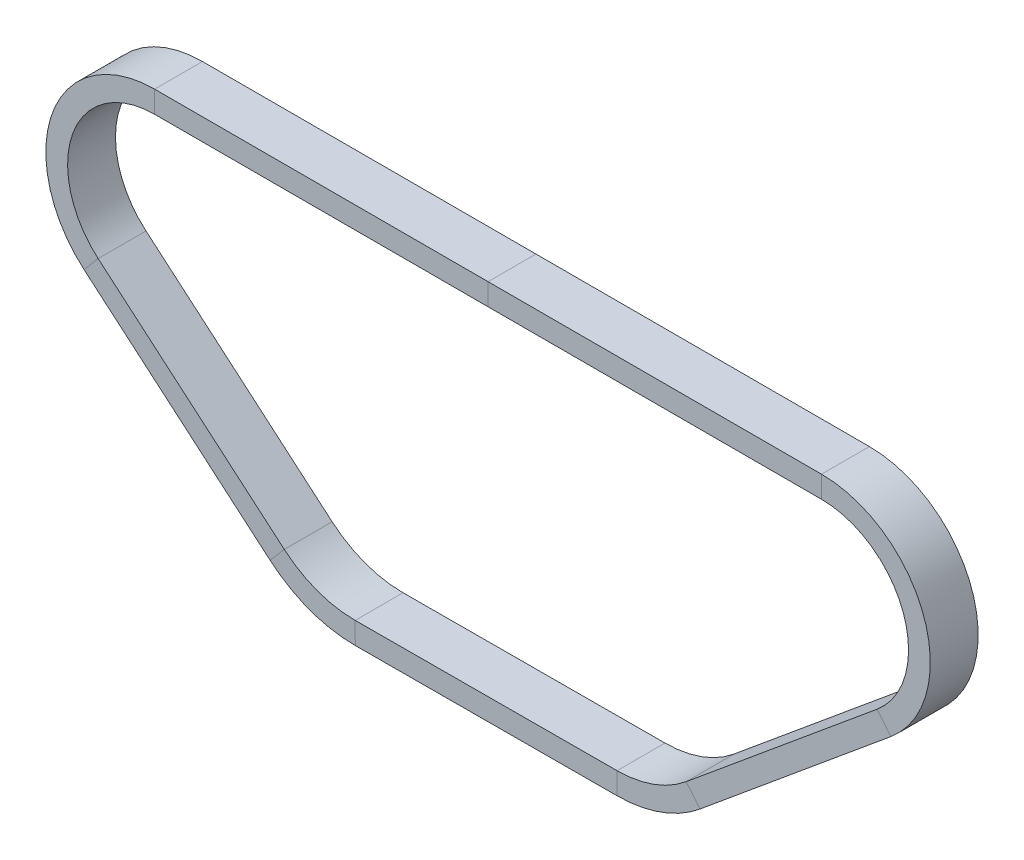
ISO-10303-21;
HEADER;
FILE_DESCRIPTION(('STEP AP214'),'2;1');
FILE_NAME('part.step','',(''),(''),'','','');
FILE_SCHEMA(('AUTOMOTIVE_DESIGN { 1 0 10303 214 1 1 1 1 }'));
ENDSEC;
DATA;
#1=APPLICATION_CONTEXT('core data for automotive mechanical design processes');
#2=APPLICATION_PROTOCOL_DEFINITION('international standard','automotive_design',2000,#1);
#3=PRODUCT_CONTEXT('',#1,'mechanical');
#4=PRODUCT('Part','Part','',(#3));
#5=PRODUCT_RELATED_PRODUCT_CATEGORY('part','',(#4));
#6=PRODUCT_DEFINITION_FORMATION('','',#4);
#7=PRODUCT_DEFINITION_CONTEXT('part definition',#1,'design');
#8=PRODUCT_DEFINITION('design','',#6,#7);
#9=PRODUCT_DEFINITION_SHAPE('','',#8);
#10=(LENGTH_UNIT() NAMED_UNIT(*) SI_UNIT(.MILLI.,.METRE.));
#11=(NAMED_UNIT(*) PLANE_ANGLE_UNIT() SI_UNIT($,.RADIAN.));
#12=(NAMED_UNIT(*) SI_UNIT($,.STERADIAN.) SOLID_ANGLE_UNIT());
#13=UNCERTAINTY_MEASURE_WITH_UNIT(LENGTH_MEASURE(1.E-05),#10,'distance_accuracy_value','');
#14=(GEOMETRIC_REPRESENTATION_CONTEXT(3) GLOBAL_UNCERTAINTY_ASSIGNED_CONTEXT((#13)) GLOBAL_UNIT_ASSIGNED_CONTEXT((#10,
#11,#12)) REPRESENTATION_CONTEXT('',''));
#15=CARTESIAN_POINT('',(0.,0.,0.));
#16=DIRECTION('',(0.,0.,1.));
#17=DIRECTION('',(1.,0.,0.));
#18=AXIS2_PLACEMENT_3D('',#15,#16,#17);
#19=CARTESIAN_POINT('',(766.320606961868,438.425171825375,55.));
#20=DIRECTION('',(0.,0.,-1.));
#21=DIRECTION('',(0.,1.,0.));
#22=AXIS2_PLACEMENT_3D('',#19,#20,#21);
#23=PLANE('',#22);
#24=DIRECTION('',(0.,-1.,0.));
#25=VECTOR('',#24,1.);
#26=CARTESIAN_POINT('',(766.320606961868,438.425171825375,55.));
#27=LINE('',#26,#25);
#28=CARTESIAN_POINT('',(766.320606961868,438.425171825375,55.));
#29=VERTEX_POINT('',#28);
#30=CARTESIAN_POINT('',(766.320606961868,388.425171825375,55.));
#31=VERTEX_POINT('',#30);
#32=EDGE_CURVE('E214',#29,#31,#27,.T.);
#33=ORIENTED_EDGE('',*,*,#32,.F.);
#34=DIRECTION('',(-1.,0.,0.));
#35=VECTOR('',#34,1.);
#36=CARTESIAN_POINT('',(766.320606961868,438.425171825375,55.));
#37=LINE('',#36,#35);
#38=CARTESIAN_POINT('',(0.,438.425171825375,55.));
#39=VERTEX_POINT('',#38);
#40=EDGE_CURVE('E213',#29,#39,#37,.T.);
#41=ORIENTED_EDGE('',*,*,#40,.T.);
#42=DIRECTION('',(0.,-1.,0.));
#43=VECTOR('',#42,1.);
#44=CARTESIAN_POINT('',(0.,438.425171825375,55.));
#45=LINE('',#44,#43);
#46=CARTESIAN_POINT('',(0.,388.425171825375,55.));
#47=VERTEX_POINT('',#46);
#48=EDGE_CURVE('E188',#39,#47,#45,.T.);
#49=ORIENTED_EDGE('',*,*,#48,.T.);
#50=DIRECTION('',(-1.,0.,0.));
#51=VECTOR('',#50,1.);
#52=CARTESIAN_POINT('',(766.320606961868,388.425171825375,55.));
#53=LINE('',#52,#51);
#54=EDGE_CURVE('E218',#31,#47,#53,.T.);
#55=ORIENTED_EDGE('',*,*,#54,.F.);
#56=EDGE_LOOP('',(#33,#41,#49,#55));
#57=FACE_BOUND('',#56,.T.);
#58=ADVANCED_FACE('F32',(#57),#23,.F.);
#59=CARTESIAN_POINT('',(0.,438.425171825375,55.));
#60=DIRECTION('',(0.,0.,-1.));
#61=DIRECTION('',(0.,1.,0.));
#62=AXIS2_PLACEMENT_3D('',#59,#60,#61);
#63=PLANE('',#62);
#64=DIRECTION('',(-1.,0.,0.));
#65=VECTOR('',#64,1.);
#66=CARTESIAN_POINT('',(0.,388.425171825375,55.));
#67=LINE('',#66,#65);
#68=CARTESIAN_POINT('',(-766.320606961868,388.425171825375,55.));
#69=VERTEX_POINT('',#68);
#70=EDGE_CURVE('E194',#47,#69,#67,.T.);
#71=ORIENTED_EDGE('',*,*,#70,.F.);
#72=ORIENTED_EDGE('',*,*,#48,.F.);
#73=DIRECTION('',(-1.,0.,0.));
#74=VECTOR('',#73,1.);
#75=CARTESIAN_POINT('',(0.,438.425171825375,55.));
#76=LINE('',#75,#74);
#77=CARTESIAN_POINT('',(-766.320606961868,438.425171825375,55.));
#78=VERTEX_POINT('',#77);
#79=EDGE_CURVE('E192',#39,#78,#76,.T.);
#80=ORIENTED_EDGE('',*,*,#79,.T.);
#81=DIRECTION('',(0.,-1.,0.));
#82=VECTOR('',#81,1.);
#83=CARTESIAN_POINT('',(-766.320606961868,438.425171825375,55.));
#84=LINE('',#83,#82);
#85=EDGE_CURVE('E210',#78,#69,#84,.T.);
#86=ORIENTED_EDGE('',*,*,#85,.T.);
#87=EDGE_LOOP('',(#71,#72,#80,#86));
#88=FACE_BOUND('',#87,.T.);
#89=ADVANCED_FACE('F190',(#88),#63,.F.);
#90=CARTESIAN_POINT('',(0.,388.425171825375,55.));
#91=DIRECTION('',(0.,1.,0.));
#92=DIRECTION('',(-1.,0.,0.));
#93=AXIS2_PLACEMENT_3D('',#90,#91,#92);
#94=PLANE('',#93);
#95=DIRECTION('',(-1.,0.,0.));
#96=VECTOR('',#95,1.);
#97=CARTESIAN_POINT('',(0.,388.425171825375,-55.));
#98=LINE('',#97,#96);
#99=CARTESIAN_POINT('',(0.,388.425171825375,-55.));
#100=VERTEX_POINT('',#99);
#101=CARTESIAN_POINT('',(-766.320606961868,388.425171825375,-55.));
#102=VERTEX_POINT('',#101);
#103=EDGE_CURVE('E275',#100,#102,#98,.T.);
#104=ORIENTED_EDGE('',*,*,#103,.F.);
#105=DIRECTION('',(0.,0.,-1.));
#106=VECTOR('',#105,1.);
#107=CARTESIAN_POINT('',(0.,388.425171825375,55.));
#108=LINE('',#107,#106);
#109=EDGE_CURVE('E199',#47,#100,#108,.T.);
#110=ORIENTED_EDGE('',*,*,#109,.F.);
#111=ORIENTED_EDGE('',*,*,#70,.T.);
#112=DIRECTION('',(0.,0.,-1.));
#113=VECTOR('',#112,1.);
#114=CARTESIAN_POINT('',(-766.320606961868,388.425171825375,55.));
#115=LINE('',#114,#113);
#116=EDGE_CURVE('E331',#69,#102,#115,.T.);
#117=ORIENTED_EDGE('',*,*,#116,.T.);
#118=EDGE_LOOP('',(#104,#110,#111,#117));
#119=FACE_BOUND('',#118,.T.);
#120=ADVANCED_FACE('F369',(#119),#94,.F.);
#121=CARTESIAN_POINT('',(0.,438.425171825375,-55.));
#122=DIRECTION('',(0.,0.,1.));
#123=DIRECTION('',(0.,-1.,0.));
#124=AXIS2_PLACEMENT_3D('',#121,#122,#123);
#125=PLANE('',#124);
#126=DIRECTION('',(-1.,0.,0.));
#127=VECTOR('',#126,1.);
#128=CARTESIAN_POINT('',(0.,438.425171825375,-55.));
#129=LINE('',#128,#127);
#130=CARTESIAN_POINT('',(0.,438.425171825375,-55.));
#131=VERTEX_POINT('',#130);
#132=CARTESIAN_POINT('',(-766.320606961868,438.425171825375,-55.));
#133=VERTEX_POINT('',#132);
#134=EDGE_CURVE('E229',#131,#133,#129,.T.);
#135=ORIENTED_EDGE('',*,*,#134,.F.);
#136=DIRECTION('',(0.,1.,0.));
#137=VECTOR('',#136,1.);
#138=CARTESIAN_POINT('',(0.,438.425171825375,-55.));
#139=LINE('',#138,#137);
#140=EDGE_CURVE('E221',#100,#131,#139,.T.);
#141=ORIENTED_EDGE('',*,*,#140,.F.);
#142=ORIENTED_EDGE('',*,*,#103,.T.);
#143=DIRECTION('',(0.,1.,0.));
#144=VECTOR('',#143,1.);
#145=CARTESIAN_POINT('',(-766.320606961868,438.425171825375,-55.));
#146=LINE('',#145,#144);
#147=EDGE_CURVE('E278',#102,#133,#146,.T.);
#148=ORIENTED_EDGE('',*,*,#147,.T.);
#149=EDGE_LOOP('',(#135,#141,#142,#148));
#150=FACE_BOUND('',#149,.T.);
#151=ADVANCED_FACE('F273',(#150),#125,.F.);
#152=CARTESIAN_POINT('',(0.,438.425171825375,55.));
#153=DIRECTION('',(0.,-1.,0.));
#154=DIRECTION('',(1.,0.,0.));
#155=AXIS2_PLACEMENT_3D('',#152,#153,#154);
#156=PLANE('',#155);
#157=DIRECTION('',(0.,0.,1.));
#158=VECTOR('',#157,1.);
#159=CARTESIAN_POINT('',(-766.320606961868,438.425171825375,55.));
#160=LINE('',#159,#158);
#161=EDGE_CURVE('E208',#133,#78,#160,.T.);
#162=ORIENTED_EDGE('',*,*,#161,.T.);
#163=ORIENTED_EDGE('',*,*,#79,.F.);
#164=DIRECTION('',(0.,0.,1.));
#165=VECTOR('',#164,1.);
#166=CARTESIAN_POINT('',(0.,438.425171825375,55.));
#167=LINE('',#166,#165);
#168=EDGE_CURVE('E206',#131,#39,#167,.T.);
#169=ORIENTED_EDGE('',*,*,#168,.F.);
#170=ORIENTED_EDGE('',*,*,#134,.T.);
#171=EDGE_LOOP('',(#162,#163,#169,#170));
#172=FACE_BOUND('',#171,.T.);
#173=ADVANCED_FACE('F204',(#172),#156,.F.);
#174=CARTESIAN_POINT('',(-766.320606961868,438.425171825375,55.));
#175=DIRECTION('',(0.,0.,-1.));
#176=DIRECTION('',(-1.,0.,0.));
#177=AXIS2_PLACEMENT_3D('',#174,#175,#176);
#178=PLANE('',#177);
#179=CARTESIAN_POINT('',(-766.320606961868,188.425171825375,55.));
#180=DIRECTION('',(0.,0.,1.));
#181=DIRECTION('',(0.,1.,0.));
#182=AXIS2_PLACEMENT_3D('',#179,#180,#181);
#183=CIRCLE('',#182,200.);
#184=CARTESIAN_POINT('',(-896.121286343144,36.2680700122841,55.));
#185=VERTEX_POINT('',#184);
#186=EDGE_CURVE('E337',#69,#185,#183,.T.);
#187=ORIENTED_EDGE('',*,*,#186,.F.);
#188=ORIENTED_EDGE('',*,*,#85,.F.);
#189=CARTESIAN_POINT('',(-766.320606961868,188.425171825375,55.));
#190=DIRECTION('',(0.,0.,1.));
#191=DIRECTION('',(0.,1.,0.));
#192=AXIS2_PLACEMENT_3D('',#189,#190,#191);
#193=CIRCLE('',#192,250.);
#194=CARTESIAN_POINT('',(-928.571456188463,-1.77120544098852,55.));
#195=VERTEX_POINT('',#194);
#196=EDGE_CURVE('E228',#78,#195,#193,.T.);
#197=ORIENTED_EDGE('',*,*,#196,.T.);
#198=DIRECTION('',(0.649003396906381,0.760785509065452,0.));
#199=VECTOR('',#198,1.);
#200=CARTESIAN_POINT('',(-928.571456188463,-1.77120544098858,55.));
#201=LINE('',#200,#199);
#202=EDGE_CURVE('E387',#195,#185,#201,.T.);
#203=ORIENTED_EDGE('',*,*,#202,.T.);
#204=EDGE_LOOP('',(#187,#188,#197,#203));
#205=FACE_BOUND('',#204,.T.);
#206=ADVANCED_FACE('F457',(#205),#178,.F.);
#207=CARTESIAN_POINT('',(-766.320606961868,188.425171825375,0.));
#208=DIRECTION('',(0.,0.,1.));
#209=DIRECTION('',(1.,0.,0.));
#210=AXIS2_PLACEMENT_3D('',#207,#208,#209);
#211=CYLINDRICAL_SURFACE('',#210,200.);
#212=CARTESIAN_POINT('',(-766.320606961868,188.425171825375,-55.));
#213=DIRECTION('',(0.,0.,1.));
#214=DIRECTION('',(0.,1.,0.));
#215=AXIS2_PLACEMENT_3D('',#212,#213,#214);
#216=CIRCLE('',#215,200.);
#217=CARTESIAN_POINT('',(-896.121286343144,36.2680700122841,-55.));
#218=VERTEX_POINT('',#217);
#219=EDGE_CURVE('E286',#102,#218,#216,.T.);
#220=ORIENTED_EDGE('',*,*,#219,.F.);
#221=ORIENTED_EDGE('',*,*,#116,.F.);
#222=ORIENTED_EDGE('',*,*,#186,.T.);
#223=DIRECTION('',(0.,0.,-1.));
#224=VECTOR('',#223,1.);
#225=CARTESIAN_POINT('',(-896.121286343144,36.268070012284,55.));
#226=LINE('',#225,#224);
#227=EDGE_CURVE('E334',#185,#218,#226,.T.);
#228=ORIENTED_EDGE('',*,*,#227,.T.);
#229=EDGE_LOOP('',(#220,#221,#222,#228));
#230=FACE_BOUND('',#229,.T.);
#231=ADVANCED_FACE('F373',(#230),#211,.F.);
#232=CARTESIAN_POINT('',(-766.320606961868,438.425171825375,-55.));
#233=DIRECTION('',(0.,0.,1.));
#234=DIRECTION('',(1.,0.,0.));
#235=AXIS2_PLACEMENT_3D('',#232,#233,#234);
#236=PLANE('',#235);
#237=CARTESIAN_POINT('',(-766.320606961868,188.425171825375,-55.));
#238=DIRECTION('',(0.,0.,1.));
#239=DIRECTION('',(0.,1.,0.));
#240=AXIS2_PLACEMENT_3D('',#237,#238,#239);
#241=CIRCLE('',#240,250.);
#242=CARTESIAN_POINT('',(-928.571456188463,-1.77120544098852,-55.));
#243=VERTEX_POINT('',#242);
#244=EDGE_CURVE('E234',#133,#243,#241,.T.);
#245=ORIENTED_EDGE('',*,*,#244,.F.);
#246=ORIENTED_EDGE('',*,*,#147,.F.);
#247=ORIENTED_EDGE('',*,*,#219,.T.);
#248=DIRECTION('',(-0.649003396906381,-0.760785509065452,0.));
#249=VECTOR('',#248,1.);
#250=CARTESIAN_POINT('',(-928.571456188463,-1.77120544098858,-55.));
#251=LINE('',#250,#249);
#252=EDGE_CURVE('E283',#218,#243,#251,.T.);
#253=ORIENTED_EDGE('',*,*,#252,.T.);
#254=EDGE_LOOP('',(#245,#246,#247,#253));
#255=FACE_BOUND('',#254,.T.);
#256=ADVANCED_FACE('F377',(#255),#236,.F.);
#257=CARTESIAN_POINT('',(-766.320606961868,188.425171825375,0.));
#258=DIRECTION('',(0.,0.,1.));
#259=DIRECTION('',(1.,0.,0.));
#260=AXIS2_PLACEMENT_3D('',#257,#258,#259);
#261=CYLINDRICAL_SURFACE('',#260,250.);
#262=DIRECTION('',(0.,0.,1.));
#263=VECTOR('',#262,1.);
#264=CARTESIAN_POINT('',(-928.571456188463,-1.77120544098858,55.));
#265=LINE('',#264,#263);
#266=EDGE_CURVE('E230',#243,#195,#265,.T.);
#267=ORIENTED_EDGE('',*,*,#266,.T.);
#268=ORIENTED_EDGE('',*,*,#196,.F.);
#269=ORIENTED_EDGE('',*,*,#161,.F.);
#270=ORIENTED_EDGE('',*,*,#244,.T.);
#271=EDGE_LOOP('',(#267,#268,#269,#270));
#272=FACE_BOUND('',#271,.T.);
#273=ADVANCED_FACE('F381',(#272),#261,.T.);
#274=CARTESIAN_POINT('',(-928.571456188463,-1.77120544098858,55.));
#275=DIRECTION('',(0.,0.,-1.));
#276=DIRECTION('',(0.,1.,0.));
#277=AXIS2_PLACEMENT_3D('',#274,#275,#276);
#278=PLANE('',#277);
#279=DIRECTION('',(0.760785509065453,-0.64900339690638,0.));
#280=VECTOR('',#279,1.);
#281=CARTESIAN_POINT('',(-896.121286343144,36.268070012284,55.));
#282=LINE('',#281,#280);
#283=CARTESIAN_POINT('',(-468.384334663063,-328.621549091738,55.));
#284=VERTEX_POINT('',#283);
#285=EDGE_CURVE('E342',#185,#284,#282,.T.);
#286=ORIENTED_EDGE('',*,*,#285,.F.);
#287=ORIENTED_EDGE('',*,*,#202,.F.);
#288=DIRECTION('',(0.760785509065453,-0.64900339690638,0.));
#289=VECTOR('',#288,1.);
#290=CARTESIAN_POINT('',(-928.571456188463,-1.77120544098858,55.));
#291=LINE('',#290,#289);
#292=CARTESIAN_POINT('',(-500.834504508382,-366.660824545011,55.));
#293=VERTEX_POINT('',#292);
#294=EDGE_CURVE('E233',#195,#293,#291,.T.);
#295=ORIENTED_EDGE('',*,*,#294,.T.);
#296=DIRECTION('',(0.64900339690638,0.760785509065453,0.));
#297=VECTOR('',#296,1.);
#298=CARTESIAN_POINT('',(-500.834504508382,-366.660824545011,55.));
#299=LINE('',#298,#297);
#300=EDGE_CURVE('E392',#293,#284,#299,.T.);
#301=ORIENTED_EDGE('',*,*,#300,.T.);
#302=EDGE_LOOP('',(#286,#287,#295,#301));
#303=FACE_BOUND('',#302,.T.);
#304=ADVANCED_FACE('F455',(#303),#278,.F.);
#305=CARTESIAN_POINT('',(-896.121286343144,36.268070012284,55.));
#306=DIRECTION('',(-0.64900339690638,-0.760785509065453,0.));
#307=DIRECTION('',(0.760785509065453,-0.64900339690638,0.));
#308=AXIS2_PLACEMENT_3D('',#305,#306,#307);
#309=PLANE('',#308);
#310=DIRECTION('',(0.760785509065453,-0.64900339690638,0.));
#311=VECTOR('',#310,1.);
#312=CARTESIAN_POINT('',(-896.121286343144,36.268070012284,-55.));
#313=LINE('',#312,#311);
#314=CARTESIAN_POINT('',(-468.384334663063,-328.621549091738,-55.));
#315=VERTEX_POINT('',#314);
#316=EDGE_CURVE('E291',#218,#315,#313,.T.);
#317=ORIENTED_EDGE('',*,*,#316,.F.);
#318=ORIENTED_EDGE('',*,*,#227,.F.);
#319=ORIENTED_EDGE('',*,*,#285,.T.);
#320=DIRECTION('',(0.,0.,-1.));
#321=VECTOR('',#320,1.);
#322=CARTESIAN_POINT('',(-468.384334663063,-328.621549091738,55.));
#323=LINE('',#322,#321);
#324=EDGE_CURVE('E339',#284,#315,#323,.T.);
#325=ORIENTED_EDGE('',*,*,#324,.T.);
#326=EDGE_LOOP('',(#317,#318,#319,#325));
#327=FACE_BOUND('',#326,.T.);
#328=ADVANCED_FACE('F454',(#327),#309,.F.);
#329=CARTESIAN_POINT('',(-928.571456188463,-1.77120544098858,-55.));
#330=DIRECTION('',(0.,0.,1.));
#331=DIRECTION('',(0.,-1.,0.));
#332=AXIS2_PLACEMENT_3D('',#329,#330,#331);
#333=PLANE('',#332);
#334=DIRECTION('',(0.760785509065453,-0.64900339690638,0.));
#335=VECTOR('',#334,1.);
#336=CARTESIAN_POINT('',(-928.571456188463,-1.77120544098858,-55.));
#337=LINE('',#336,#335);
#338=CARTESIAN_POINT('',(-500.834504508382,-366.660824545011,-55.));
#339=VERTEX_POINT('',#338);
#340=EDGE_CURVE('E239',#243,#339,#337,.T.);
#341=ORIENTED_EDGE('',*,*,#340,.F.);
#342=ORIENTED_EDGE('',*,*,#252,.F.);
#343=ORIENTED_EDGE('',*,*,#316,.T.);
#344=DIRECTION('',(-0.64900339690638,-0.760785509065453,0.));
#345=VECTOR('',#344,1.);
#346=CARTESIAN_POINT('',(-500.834504508382,-366.660824545011,-55.));
#347=LINE('',#346,#345);
#348=EDGE_CURVE('E288',#315,#339,#347,.T.);
#349=ORIENTED_EDGE('',*,*,#348,.T.);
#350=EDGE_LOOP('',(#341,#342,#343,#349));
#351=FACE_BOUND('',#350,.T.);
#352=ADVANCED_FACE('F452',(#351),#333,.F.);
#353=CARTESIAN_POINT('',(-928.571456188463,-1.77120544098858,55.));
#354=DIRECTION('',(0.64900339690638,0.760785509065453,0.));
#355=DIRECTION('',(-0.760785509065453,0.64900339690638,0.));
#356=AXIS2_PLACEMENT_3D('',#353,#354,#355);
#357=PLANE('',#356);
#358=DIRECTION('',(0.,0.,1.));
#359=VECTOR('',#358,1.);
#360=CARTESIAN_POINT('',(-500.834504508382,-366.660824545011,55.));
#361=LINE('',#360,#359);
#362=EDGE_CURVE('E235',#339,#293,#361,.T.);
#363=ORIENTED_EDGE('',*,*,#362,.T.);
#364=ORIENTED_EDGE('',*,*,#294,.F.);
#365=ORIENTED_EDGE('',*,*,#266,.F.);
#366=ORIENTED_EDGE('',*,*,#340,.T.);
#367=EDGE_LOOP('',(#363,#364,#365,#366));
#368=FACE_BOUND('',#367,.T.);
#369=ADVANCED_FACE('F450',(#368),#357,.F.);
#370=CARTESIAN_POINT('',(-500.834504508382,-366.660824545011,55.));
#371=DIRECTION('',(0.,0.,-1.));
#372=DIRECTION('',(-1.,0.,0.));
#373=AXIS2_PLACEMENT_3D('',#370,#371,#372);
#374=PLANE('',#373);
#375=CARTESIAN_POINT('',(-306.133485436468,-138.425171825375,55.));
#376=DIRECTION('',(0.,0.,1.));
#377=DIRECTION('',(-0.649003396906381,-0.760785509065452,0.));
#378=AXIS2_PLACEMENT_3D('',#375,#376,#377);
#379=CIRCLE('',#378,250.);
#380=CARTESIAN_POINT('',(-305.36994160237,-388.424005824283,55.));
#381=VERTEX_POINT('',#380);
#382=EDGE_CURVE('E347',#284,#381,#379,.T.);
#383=ORIENTED_EDGE('',*,*,#382,.F.);
#384=ORIENTED_EDGE('',*,*,#300,.F.);
#385=CARTESIAN_POINT('',(-306.133485436468,-138.425171825375,55.));
#386=DIRECTION('',(0.,0.,1.));
#387=DIRECTION('',(-0.649003396906381,-0.760785509065452,0.));
#388=AXIS2_PLACEMENT_3D('',#385,#386,#387);
#389=CIRCLE('',#388,300.);
#390=CARTESIAN_POINT('',(-305.217232835551,-438.423772624064,55.));
#391=VERTEX_POINT('',#390);
#392=EDGE_CURVE('E238',#293,#391,#389,.T.);
#393=ORIENTED_EDGE('',*,*,#392,.T.);
#394=DIRECTION('',(-0.00305417533639116,0.999995335995631,0.));
#395=VECTOR('',#394,1.);
#396=CARTESIAN_POINT('',(-305.217232835551,-438.423772624064,55.));
#397=LINE('',#396,#395);
#398=EDGE_CURVE('E397',#391,#381,#397,.T.);
#399=ORIENTED_EDGE('',*,*,#398,.T.);
#400=EDGE_LOOP('',(#383,#384,#393,#399));
#401=FACE_BOUND('',#400,.T.);
#402=ADVANCED_FACE('F446',(#401),#374,.F.);
#403=CARTESIAN_POINT('',(-306.133485436468,-138.425171825375,0.));
#404=DIRECTION('',(0.,0.,1.));
#405=DIRECTION('',(1.,0.,0.));
#406=AXIS2_PLACEMENT_3D('',#403,#404,#405);
#407=CYLINDRICAL_SURFACE('',#406,250.);
#408=CARTESIAN_POINT('',(-306.133485436468,-138.425171825375,-55.));
#409=DIRECTION('',(0.,0.,1.));
#410=DIRECTION('',(-0.649003396906381,-0.760785509065452,0.));
#411=AXIS2_PLACEMENT_3D('',#408,#409,#410);
#412=CIRCLE('',#411,250.);
#413=CARTESIAN_POINT('',(-305.36994160237,-388.424005824283,-55.));
#414=VERTEX_POINT('',#413);
#415=EDGE_CURVE('E296',#315,#414,#412,.T.);
#416=ORIENTED_EDGE('',*,*,#415,.F.);
#417=ORIENTED_EDGE('',*,*,#324,.F.);
#418=ORIENTED_EDGE('',*,*,#382,.T.);
#419=DIRECTION('',(0.,0.,-1.));
#420=VECTOR('',#419,1.);
#421=CARTESIAN_POINT('',(-305.36994160237,-388.424005824283,55.));
#422=LINE('',#421,#420);
#423=EDGE_CURVE('E344',#381,#414,#422,.T.);
#424=ORIENTED_EDGE('',*,*,#423,.T.);
#425=EDGE_LOOP('',(#416,#417,#418,#424));
#426=FACE_BOUND('',#425,.T.);
#427=ADVANCED_FACE('F442',(#426),#407,.F.);
#428=CARTESIAN_POINT('',(-500.834504508382,-366.660824545011,-55.));
#429=DIRECTION('',(0.,0.,1.));
#430=DIRECTION('',(1.,0.,0.));
#431=AXIS2_PLACEMENT_3D('',#428,#429,#430);
#432=PLANE('',#431);
#433=CARTESIAN_POINT('',(-306.133485436468,-138.425171825375,-55.));
#434=DIRECTION('',(0.,0.,1.));
#435=DIRECTION('',(-0.649003396906381,-0.760785509065452,0.));
#436=AXIS2_PLACEMENT_3D('',#433,#434,#435);
#437=CIRCLE('',#436,300.);
#438=CARTESIAN_POINT('',(-305.217232835551,-438.423772624064,-55.));
#439=VERTEX_POINT('',#438);
#440=EDGE_CURVE('E244',#339,#439,#437,.T.);
#441=ORIENTED_EDGE('',*,*,#440,.F.);
#442=ORIENTED_EDGE('',*,*,#348,.F.);
#443=ORIENTED_EDGE('',*,*,#415,.T.);
#444=DIRECTION('',(0.00305417533639116,-0.999995335995631,0.));
#445=VECTOR('',#444,1.);
#446=CARTESIAN_POINT('',(-305.217232835551,-438.423772624064,-55.));
#447=LINE('',#446,#445);
#448=EDGE_CURVE('E293',#414,#439,#447,.T.);
#449=ORIENTED_EDGE('',*,*,#448,.T.);
#450=EDGE_LOOP('',(#441,#442,#443,#449));
#451=FACE_BOUND('',#450,.T.);
#452=ADVANCED_FACE('F438',(#451),#432,.F.);
#453=CARTESIAN_POINT('',(-306.133485436468,-138.425171825375,0.));
#454=DIRECTION('',(0.,0.,1.));
#455=DIRECTION('',(1.,0.,0.));
#456=AXIS2_PLACEMENT_3D('',#453,#454,#455);
#457=CYLINDRICAL_SURFACE('',#456,300.);
#458=DIRECTION('',(0.,0.,1.));
#459=VECTOR('',#458,1.);
#460=CARTESIAN_POINT('',(-305.217232835551,-438.423772624064,55.));
#461=LINE('',#460,#459);
#462=EDGE_CURVE('E240',#439,#391,#461,.T.);
#463=ORIENTED_EDGE('',*,*,#462,.T.);
#464=ORIENTED_EDGE('',*,*,#392,.F.);
#465=ORIENTED_EDGE('',*,*,#362,.F.);
#466=ORIENTED_EDGE('',*,*,#440,.T.);
#467=EDGE_LOOP('',(#463,#464,#465,#466));
#468=FACE_BOUND('',#467,.T.);
#469=ADVANCED_FACE('F433',(#468),#457,.T.);
#470=CARTESIAN_POINT('',(-305.217232835551,-438.423772624064,55.));
#471=DIRECTION('',(0.,0.,-1.));
#472=DIRECTION('',(0.,1.,0.));
#473=AXIS2_PLACEMENT_3D('',#470,#471,#472);
#474=PLANE('',#473);
#475=DIRECTION('',(0.999995335995631,0.00305417533639208,0.));
#476=VECTOR('',#475,1.);
#477=CARTESIAN_POINT('',(-305.36994160237,-388.424005824283,55.));
#478=LINE('',#477,#476);
#479=CARTESIAN_POINT('',(296.508341121737,-386.585755444069,55.));
#480=VERTEX_POINT('',#479);
#481=EDGE_CURVE('E352',#381,#480,#478,.T.);
#482=ORIENTED_EDGE('',*,*,#481,.F.);
#483=ORIENTED_EDGE('',*,*,#398,.F.);
#484=DIRECTION('',(0.999995335995631,0.00305417533639208,0.));
#485=VECTOR('',#484,1.);
#486=CARTESIAN_POINT('',(-305.217232835551,-438.423772624064,55.));
#487=LINE('',#486,#485);
#488=CARTESIAN_POINT('',(296.661049888556,-436.585522243851,55.));
#489=VERTEX_POINT('',#488);
#490=EDGE_CURVE('E243',#391,#489,#487,.T.);
#491=ORIENTED_EDGE('',*,*,#490,.T.);
#492=DIRECTION('',(-0.00305417533639186,0.999995335995631,0.));
#493=VECTOR('',#492,1.);
#494=CARTESIAN_POINT('',(296.661049888556,-436.585522243851,55.));
#495=LINE('',#494,#493);
#496=EDGE_CURVE('E303',#489,#480,#495,.T.);
#497=ORIENTED_EDGE('',*,*,#496,.T.);
#498=EDGE_LOOP('',(#482,#483,#491,#497));
#499=FACE_BOUND('',#498,.T.);
#500=ADVANCED_FACE('F427',(#499),#474,.F.);
#501=CARTESIAN_POINT('',(-305.36994160237,-388.424005824283,55.));
#502=DIRECTION('',(0.00305417533639208,-0.999995335995631,0.));
#503=DIRECTION('',(0.999995335995631,0.00305417533639208,0.));
#504=AXIS2_PLACEMENT_3D('',#501,#502,#503);
#505=PLANE('',#504);
#506=DIRECTION('',(0.999995335995631,0.00305417533639208,0.));
#507=VECTOR('',#506,1.);
#508=CARTESIAN_POINT('',(-305.36994160237,-388.424005824283,-55.));
#509=LINE('',#508,#507);
#510=CARTESIAN_POINT('',(296.508341121737,-386.585755444069,-55.));
#511=VERTEX_POINT('',#510);
#512=EDGE_CURVE('E304',#414,#511,#509,.T.);
#513=ORIENTED_EDGE('',*,*,#512,.F.);
#514=ORIENTED_EDGE('',*,*,#423,.F.);
#515=ORIENTED_EDGE('',*,*,#481,.T.);
#516=DIRECTION('',(0.,0.,-1.));
#517=VECTOR('',#516,1.);
#518=CARTESIAN_POINT('',(296.508341121736,-386.585755444069,55.));
#519=LINE('',#518,#517);
#520=EDGE_CURVE('E300',#480,#511,#519,.T.);
#521=ORIENTED_EDGE('',*,*,#520,.T.);
#522=EDGE_LOOP('',(#513,#514,#515,#521));
#523=FACE_BOUND('',#522,.T.);
#524=ADVANCED_FACE('F423',(#523),#505,.F.);
#525=CARTESIAN_POINT('',(-305.217232835551,-438.423772624064,-55.));
#526=DIRECTION('',(0.,0.,1.));
#527=DIRECTION('',(0.,-1.,0.));
#528=AXIS2_PLACEMENT_3D('',#525,#526,#527);
#529=PLANE('',#528);
#530=DIRECTION('',(0.999995335995631,0.00305417533639208,0.));
#531=VECTOR('',#530,1.);
#532=CARTESIAN_POINT('',(-305.217232835551,-438.423772624064,-55.));
#533=LINE('',#532,#531);
#534=CARTESIAN_POINT('',(296.661049888556,-436.585522243851,-55.));
#535=VERTEX_POINT('',#534);
#536=EDGE_CURVE('E301',#439,#535,#533,.T.);
#537=ORIENTED_EDGE('',*,*,#536,.F.);
#538=ORIENTED_EDGE('',*,*,#448,.F.);
#539=ORIENTED_EDGE('',*,*,#512,.T.);
#540=DIRECTION('',(0.00305417533639186,-0.999995335995631,0.));
#541=VECTOR('',#540,1.);
#542=CARTESIAN_POINT('',(296.661049888556,-436.585522243851,-55.));
#543=LINE('',#542,#541);
#544=EDGE_CURVE('E249',#511,#535,#543,.T.);
#545=ORIENTED_EDGE('',*,*,#544,.T.);
#546=EDGE_LOOP('',(#537,#538,#539,#545));
#547=FACE_BOUND('',#546,.T.);
#548=ADVANCED_FACE('F417',(#547),#529,.F.);
#549=CARTESIAN_POINT('',(-305.217232835551,-438.423772624064,55.));
#550=DIRECTION('',(-0.00305417533639208,0.999995335995631,0.));
#551=DIRECTION('',(-0.999995335995631,-0.00305417533639208,0.));
#552=AXIS2_PLACEMENT_3D('',#549,#550,#551);
#553=PLANE('',#552);
#554=DIRECTION('',(0.,0.,1.));
#555=VECTOR('',#554,1.);
#556=CARTESIAN_POINT('',(296.661049888556,-436.585522243851,55.));
#557=LINE('',#556,#555);
#558=EDGE_CURVE('E245',#535,#489,#557,.T.);
#559=ORIENTED_EDGE('',*,*,#558,.T.);
#560=ORIENTED_EDGE('',*,*,#490,.F.);
#561=ORIENTED_EDGE('',*,*,#462,.F.);
#562=ORIENTED_EDGE('',*,*,#536,.T.);
#563=EDGE_LOOP('',(#559,#560,#561,#562));
#564=FACE_BOUND('',#563,.T.);
#565=ADVANCED_FACE('F430',(#564),#553,.F.);
#566=CARTESIAN_POINT('',(296.661049888556,-436.585522243851,55.));
#567=DIRECTION('',(0.,0.,-1.));
#568=DIRECTION('',(-1.,0.,0.));
#569=AXIS2_PLACEMENT_3D('',#566,#567,#568);
#570=PLANE('',#569);
#571=CARTESIAN_POINT('',(295.744797287638,-136.586921445161,55.));
#572=DIRECTION('',(0.,0.,1.));
#573=DIRECTION('',(0.00305417533639129,-0.999995335995631,0.));
#574=AXIS2_PLACEMENT_3D('',#571,#572,#573);
#575=CIRCLE('',#574,250.);
#576=CARTESIAN_POINT('',(455.259584684157,-329.083759346057,55.));
#577=VERTEX_POINT('',#576);
#578=EDGE_CURVE('E157',#480,#577,#575,.T.);
#579=ORIENTED_EDGE('',*,*,#578,.F.);
#580=ORIENTED_EDGE('',*,*,#496,.F.);
#581=CARTESIAN_POINT('',(295.744797287638,-136.586921445161,55.));
#582=DIRECTION('',(0.,0.,1.));
#583=DIRECTION('',(0.00305417533639126,-0.999995335995631,0.));
#584=AXIS2_PLACEMENT_3D('',#581,#582,#583);
#585=CIRCLE('',#584,300.);
#586=CARTESIAN_POINT('',(487.16254216346,-367.583126926236,55.));
#587=VERTEX_POINT('',#586);
#588=EDGE_CURVE('E248',#489,#587,#585,.T.);
#589=ORIENTED_EDGE('',*,*,#588,.T.);
#590=DIRECTION('',(-0.638059149586072,0.769987351603582,0.));
#591=VECTOR('',#590,1.);
#592=CARTESIAN_POINT('',(487.16254216346,-367.583126926236,55.));
#593=LINE('',#592,#591);
#594=EDGE_CURVE('E406',#587,#577,#593,.T.);
#595=ORIENTED_EDGE('',*,*,#594,.T.);
#596=EDGE_LOOP('',(#579,#580,#589,#595));
#597=FACE_BOUND('',#596,.T.);
#598=ADVANCED_FACE('F411',(#597),#570,.F.);
#599=CARTESIAN_POINT('',(295.744797287638,-136.586921445161,0.));
#600=DIRECTION('',(0.,0.,1.));
#601=DIRECTION('',(1.,0.,0.));
#602=AXIS2_PLACEMENT_3D('',#599,#600,#601);
#603=CYLINDRICAL_SURFACE('',#602,250.);
#604=CARTESIAN_POINT('',(295.744797287638,-136.586921445161,-55.));
#605=DIRECTION('',(0.,0.,1.));
#606=DIRECTION('',(0.00305417533639129,-0.999995335995631,0.));
#607=AXIS2_PLACEMENT_3D('',#604,#605,#606);
#608=CIRCLE('',#607,250.);
#609=CARTESIAN_POINT('',(455.259584684157,-329.083759346057,-55.));
#610=VERTEX_POINT('',#609);
#611=EDGE_CURVE('E151',#511,#610,#608,.T.);
#612=ORIENTED_EDGE('',*,*,#611,.F.);
#613=ORIENTED_EDGE('',*,*,#520,.F.);
#614=ORIENTED_EDGE('',*,*,#578,.T.);
#615=DIRECTION('',(0.,0.,-1.));
#616=VECTOR('',#615,1.);
#617=CARTESIAN_POINT('',(455.259584684157,-329.083759346057,55.));
#618=LINE('',#617,#616);
#619=EDGE_CURVE('E353',#577,#610,#618,.T.);
#620=ORIENTED_EDGE('',*,*,#619,.T.);
#621=EDGE_LOOP('',(#612,#613,#614,#620));
#622=FACE_BOUND('',#621,.T.);
#623=ADVANCED_FACE('F414',(#622),#603,.F.);
#624=CARTESIAN_POINT('',(296.661049888556,-436.585522243851,-55.));
#625=DIRECTION('',(0.,0.,1.));
#626=DIRECTION('',(1.,0.,0.));
#627=AXIS2_PLACEMENT_3D('',#624,#625,#626);
#628=PLANE('',#627);
#629=CARTESIAN_POINT('',(295.744797287638,-136.586921445161,-55.));
#630=DIRECTION('',(0.,0.,1.));
#631=DIRECTION('',(0.00305417533639126,-0.999995335995631,0.));
#632=AXIS2_PLACEMENT_3D('',#629,#630,#631);
#633=CIRCLE('',#632,300.);
#634=CARTESIAN_POINT('',(487.16254216346,-367.583126926236,-55.));
#635=VERTEX_POINT('',#634);
#636=EDGE_CURVE('E253',#535,#635,#633,.T.);
#637=ORIENTED_EDGE('',*,*,#636,.F.);
#638=ORIENTED_EDGE('',*,*,#544,.F.);
#639=ORIENTED_EDGE('',*,*,#611,.T.);
#640=DIRECTION('',(0.638059149586072,-0.769987351603582,0.));
#641=VECTOR('',#640,1.);
#642=CARTESIAN_POINT('',(487.16254216346,-367.583126926236,-55.));
#643=LINE('',#642,#641);
#644=EDGE_CURVE('E305',#610,#635,#643,.T.);
#645=ORIENTED_EDGE('',*,*,#644,.T.);
#646=EDGE_LOOP('',(#637,#638,#639,#645));
#647=FACE_BOUND('',#646,.T.);
#648=ADVANCED_FACE('F311',(#647),#628,.F.);
#649=CARTESIAN_POINT('',(295.744797287638,-136.586921445161,0.));
#650=DIRECTION('',(0.,0.,1.));
#651=DIRECTION('',(1.,0.,0.));
#652=AXIS2_PLACEMENT_3D('',#649,#650,#651);
#653=CYLINDRICAL_SURFACE('',#652,300.);
#654=DIRECTION('',(0.,0.,1.));
#655=VECTOR('',#654,1.);
#656=CARTESIAN_POINT('',(487.16254216346,-367.583126926236,55.));
#657=LINE('',#656,#655);
#658=EDGE_CURVE('E250',#635,#587,#657,.T.);
#659=ORIENTED_EDGE('',*,*,#658,.T.);
#660=ORIENTED_EDGE('',*,*,#588,.F.);
#661=ORIENTED_EDGE('',*,*,#558,.F.);
#662=ORIENTED_EDGE('',*,*,#636,.T.);
#663=EDGE_LOOP('',(#659,#660,#661,#662));
#664=FACE_BOUND('',#663,.T.);
#665=ADVANCED_FACE('F309',(#664),#653,.T.);
#666=CARTESIAN_POINT('',(487.16254216346,-367.583126926236,55.));
#667=DIRECTION('',(0.,0.,-1.));
#668=DIRECTION('',(0.,1.,0.));
#669=AXIS2_PLACEMENT_3D('',#666,#667,#668);
#670=PLANE('',#669);
#671=DIRECTION('',(0.769987351603582,0.638059149586072,0.));
#672=VECTOR('',#671,1.);
#673=CARTESIAN_POINT('',(455.259584684157,-329.083759346057,55.));
#674=LINE('',#673,#672);
#675=CARTESIAN_POINT('',(893.932436879083,34.4277015046583,55.));
#676=VERTEX_POINT('',#675);
#677=EDGE_CURVE('E122',#577,#676,#674,.T.);
#678=ORIENTED_EDGE('',*,*,#677,.F.);
#679=ORIENTED_EDGE('',*,*,#594,.F.);
#680=DIRECTION('',(0.769987351603582,0.638059149586072,0.));
#681=VECTOR('',#680,1.);
#682=CARTESIAN_POINT('',(487.16254216346,-367.583126926236,55.));
#683=LINE('',#682,#681);
#684=CARTESIAN_POINT('',(925.835394358386,-4.07166607552067,55.));
#685=VERTEX_POINT('',#684);
#686=EDGE_CURVE('E252',#587,#685,#683,.T.);
#687=ORIENTED_EDGE('',*,*,#686,.T.);
#688=DIRECTION('',(-0.638059149586072,0.769987351603582,0.));
#689=VECTOR('',#688,1.);
#690=CARTESIAN_POINT('',(925.835394358386,-4.07166607552073,55.));
#691=LINE('',#690,#689);
#692=EDGE_CURVE('E317',#685,#676,#691,.T.);
#693=ORIENTED_EDGE('',*,*,#692,.T.);
#694=EDGE_LOOP('',(#678,#679,#687,#693));
#695=FACE_BOUND('',#694,.T.);
#696=ADVANCED_FACE('F412',(#695),#670,.F.);
#697=CARTESIAN_POINT('',(455.259584684157,-329.083759346057,55.));
#698=DIRECTION('',(0.638059149586072,-0.769987351603582,0.));
#699=DIRECTION('',(0.769987351603582,0.638059149586072,0.));
#700=AXIS2_PLACEMENT_3D('',#697,#698,#699);
#701=PLANE('',#700);
#702=DIRECTION('',(0.769987351603582,0.638059149586072,0.));
#703=VECTOR('',#702,1.);
#704=CARTESIAN_POINT('',(455.259584684157,-329.083759346057,-55.));
#705=LINE('',#704,#703);
#706=CARTESIAN_POINT('',(893.932436879083,34.4277015046583,-55.));
#707=VERTEX_POINT('',#706);
#708=EDGE_CURVE('E115',#610,#707,#705,.T.);
#709=ORIENTED_EDGE('',*,*,#708,.F.);
#710=ORIENTED_EDGE('',*,*,#619,.F.);
#711=ORIENTED_EDGE('',*,*,#677,.T.);
#712=DIRECTION('',(0.,0.,-1.));
#713=VECTOR('',#712,1.);
#714=CARTESIAN_POINT('',(893.932436879083,34.4277015046583,55.));
#715=LINE('',#714,#713);
#716=EDGE_CURVE('E356',#676,#707,#715,.T.);
#717=ORIENTED_EDGE('',*,*,#716,.T.);
#718=EDGE_LOOP('',(#709,#710,#711,#717));
#719=FACE_BOUND('',#718,.T.);
#720=ADVANCED_FACE('F413',(#719),#701,.F.);
#721=CARTESIAN_POINT('',(487.16254216346,-367.583126926236,-55.));
#722=DIRECTION('',(0.,0.,1.));
#723=DIRECTION('',(0.,-1.,0.));
#724=AXIS2_PLACEMENT_3D('',#721,#722,#723);
#725=PLANE('',#724);
#726=DIRECTION('',(0.769987351603582,0.638059149586072,0.));
#727=VECTOR('',#726,1.);
#728=CARTESIAN_POINT('',(487.16254216346,-367.583126926236,-55.));
#729=LINE('',#728,#727);
#730=CARTESIAN_POINT('',(925.835394358386,-4.07166607552067,-55.));
#731=VERTEX_POINT('',#730);
#732=EDGE_CURVE('E106',#635,#731,#729,.T.);
#733=ORIENTED_EDGE('',*,*,#732,.F.);
#734=ORIENTED_EDGE('',*,*,#644,.F.);
#735=ORIENTED_EDGE('',*,*,#708,.T.);
#736=DIRECTION('',(0.638059149586072,-0.769987351603582,0.));
#737=VECTOR('',#736,1.);
#738=CARTESIAN_POINT('',(925.835394358386,-4.07166607552073,-55.));
#739=LINE('',#738,#737);
#740=EDGE_CURVE('E259',#707,#731,#739,.T.);
#741=ORIENTED_EDGE('',*,*,#740,.T.);
#742=EDGE_LOOP('',(#733,#734,#735,#741));
#743=FACE_BOUND('',#742,.T.);
#744=ADVANCED_FACE('F312',(#743),#725,.F.);
#745=CARTESIAN_POINT('',(487.16254216346,-367.583126926236,55.));
#746=DIRECTION('',(-0.638059149586072,0.769987351603582,0.));
#747=DIRECTION('',(-0.769987351603582,-0.638059149586072,0.));
#748=AXIS2_PLACEMENT_3D('',#745,#746,#747);
#749=PLANE('',#748);
#750=DIRECTION('',(0.,0.,1.));
#751=VECTOR('',#750,1.);
#752=CARTESIAN_POINT('',(925.835394358386,-4.07166607552073,55.));
#753=LINE('',#752,#751);
#754=EDGE_CURVE('E254',#731,#685,#753,.T.);
#755=ORIENTED_EDGE('',*,*,#754,.T.);
#756=ORIENTED_EDGE('',*,*,#686,.F.);
#757=ORIENTED_EDGE('',*,*,#658,.F.);
#758=ORIENTED_EDGE('',*,*,#732,.T.);
#759=EDGE_LOOP('',(#755,#756,#757,#758));
#760=FACE_BOUND('',#759,.T.);
#761=ADVANCED_FACE('F313',(#760),#749,.F.);
#762=CARTESIAN_POINT('',(925.835394358386,-4.07166607552079,55.));
#763=DIRECTION('',(0.,0.,-1.));
#764=DIRECTION('',(-1.,0.,0.));
#765=AXIS2_PLACEMENT_3D('',#762,#763,#764);
#766=PLANE('',#765);
#767=CARTESIAN_POINT('',(766.320606961868,188.425171825375,55.));
#768=DIRECTION('',(0.,0.,1.));
#769=DIRECTION('',(0.638059149586072,-0.769987351603582,0.));
#770=AXIS2_PLACEMENT_3D('',#767,#768,#769);
#771=CIRCLE('',#770,200.);
#772=EDGE_CURVE('E323',#676,#31,#771,.T.);
#773=ORIENTED_EDGE('',*,*,#772,.F.);
#774=ORIENTED_EDGE('',*,*,#692,.F.);
#775=CARTESIAN_POINT('',(766.320606961868,188.425171825375,55.));
#776=DIRECTION('',(0.,0.,1.));
#777=DIRECTION('',(0.638059149586072,-0.769987351603582,0.));
#778=AXIS2_PLACEMENT_3D('',#775,#776,#777);
#779=CIRCLE('',#778,250.);
#780=EDGE_CURVE('E255',#685,#29,#779,.T.);
#781=ORIENTED_EDGE('',*,*,#780,.T.);
#782=ORIENTED_EDGE('',*,*,#32,.T.);
#783=EDGE_LOOP('',(#773,#774,#781,#782));
#784=FACE_BOUND('',#783,.T.);
#785=ADVANCED_FACE('F477',(#784),#766,.F.);
#786=CARTESIAN_POINT('',(766.320606961868,188.425171825375,0.));
#787=DIRECTION('',(0.,0.,1.));
#788=DIRECTION('',(1.,0.,0.));
#789=AXIS2_PLACEMENT_3D('',#786,#787,#788);
#790=CYLINDRICAL_SURFACE('',#789,200.);
#791=CARTESIAN_POINT('',(766.320606961868,188.425171825375,-55.));
#792=DIRECTION('',(0.,0.,1.));
#793=DIRECTION('',(0.638059149586072,-0.769987351603582,0.));
#794=AXIS2_PLACEMENT_3D('',#791,#792,#793);
#795=CIRCLE('',#794,200.);
#796=CARTESIAN_POINT('',(766.320606961868,388.425171825375,-55.));
#797=VERTEX_POINT('',#796);
#798=EDGE_CURVE('E57',#707,#797,#795,.T.);
#799=ORIENTED_EDGE('',*,*,#798,.F.);
#800=ORIENTED_EDGE('',*,*,#716,.F.);
#801=ORIENTED_EDGE('',*,*,#772,.T.);
#802=DIRECTION('',(0.,0.,-1.));
#803=VECTOR('',#802,1.);
#804=CARTESIAN_POINT('',(766.320606961868,388.425171825375,55.));
#805=LINE('',#804,#803);
#806=EDGE_CURVE('E325',#31,#797,#805,.T.);
#807=ORIENTED_EDGE('',*,*,#806,.T.);
#808=EDGE_LOOP('',(#799,#800,#801,#807));
#809=FACE_BOUND('',#808,.T.);
#810=ADVANCED_FACE('F363',(#809),#790,.F.);
#811=CARTESIAN_POINT('',(925.835394358386,-4.07166607552079,-55.));
#812=DIRECTION('',(0.,0.,1.));
#813=DIRECTION('',(1.,0.,0.));
#814=AXIS2_PLACEMENT_3D('',#811,#812,#813);
#815=PLANE('',#814);
#816=CARTESIAN_POINT('',(766.320606961868,188.425171825375,-55.));
#817=DIRECTION('',(0.,0.,1.));
#818=DIRECTION('',(0.638059149586072,-0.769987351603582,0.));
#819=AXIS2_PLACEMENT_3D('',#816,#817,#818);
#820=CIRCLE('',#819,250.);
#821=CARTESIAN_POINT('',(766.320606961868,438.425171825375,-55.));
#822=VERTEX_POINT('',#821);
#823=EDGE_CURVE('E49',#731,#822,#820,.T.);
#824=ORIENTED_EDGE('',*,*,#823,.F.);
#825=ORIENTED_EDGE('',*,*,#740,.F.);
#826=ORIENTED_EDGE('',*,*,#798,.T.);
#827=DIRECTION('',(0.,1.,0.));
#828=VECTOR('',#827,1.);
#829=CARTESIAN_POINT('',(766.320606961868,438.425171825375,-55.));
#830=LINE('',#829,#828);
#831=EDGE_CURVE('E264',#797,#822,#830,.T.);
#832=ORIENTED_EDGE('',*,*,#831,.T.);
#833=EDGE_LOOP('',(#824,#825,#826,#832));
#834=FACE_BOUND('',#833,.T.);
#835=ADVANCED_FACE('F493',(#834),#815,.F.);
#836=CARTESIAN_POINT('',(766.320606961868,188.425171825375,0.));
#837=DIRECTION('',(0.,0.,1.));
#838=DIRECTION('',(1.,0.,0.));
#839=AXIS2_PLACEMENT_3D('',#836,#837,#838);
#840=CYLINDRICAL_SURFACE('',#839,250.);
#841=DIRECTION('',(0.,0.,1.));
#842=VECTOR('',#841,1.);
#843=CARTESIAN_POINT('',(766.320606961868,438.425171825375,55.));
#844=LINE('',#843,#842);
#845=EDGE_CURVE('E36',#822,#29,#844,.T.);
#846=ORIENTED_EDGE('',*,*,#845,.T.);
#847=ORIENTED_EDGE('',*,*,#780,.F.);
#848=ORIENTED_EDGE('',*,*,#754,.F.);
#849=ORIENTED_EDGE('',*,*,#823,.T.);
#850=EDGE_LOOP('',(#846,#847,#848,#849));
#851=FACE_BOUND('',#850,.T.);
#852=ADVANCED_FACE('F265',(#851),#840,.T.);
#853=CARTESIAN_POINT('',(766.320606961868,388.425171825375,55.));
#854=DIRECTION('',(0.,1.,0.));
#855=DIRECTION('',(-1.,0.,0.));
#856=AXIS2_PLACEMENT_3D('',#853,#854,#855);
#857=PLANE('',#856);
#858=ORIENTED_EDGE('',*,*,#54,.T.);
#859=ORIENTED_EDGE('',*,*,#109,.T.);
#860=DIRECTION('',(-1.,0.,0.));
#861=VECTOR('',#860,1.);
#862=CARTESIAN_POINT('',(766.320606961868,388.425171825375,-55.));
#863=LINE('',#862,#861);
#864=EDGE_CURVE('E41',#797,#100,#863,.T.);
#865=ORIENTED_EDGE('',*,*,#864,.F.);
#866=ORIENTED_EDGE('',*,*,#806,.F.);
#867=EDGE_LOOP('',(#858,#859,#865,#866));
#868=FACE_BOUND('',#867,.T.);
#869=ADVANCED_FACE('F367',(#868),#857,.F.);
#870=CARTESIAN_POINT('',(766.320606961868,438.425171825375,-55.));
#871=DIRECTION('',(0.,0.,1.));
#872=DIRECTION('',(0.,-1.,0.));
#873=AXIS2_PLACEMENT_3D('',#870,#871,#872);
#874=PLANE('',#873);
#875=ORIENTED_EDGE('',*,*,#864,.T.);
#876=ORIENTED_EDGE('',*,*,#140,.T.);
#877=DIRECTION('',(-1.,0.,0.));
#878=VECTOR('',#877,1.);
#879=CARTESIAN_POINT('',(766.320606961868,438.425171825375,-55.));
#880=LINE('',#879,#878);
#881=EDGE_CURVE('E11',#822,#131,#880,.T.);
#882=ORIENTED_EDGE('',*,*,#881,.F.);
#883=ORIENTED_EDGE('',*,*,#831,.F.);
#884=EDGE_LOOP('',(#875,#876,#882,#883));
#885=FACE_BOUND('',#884,.T.);
#886=ADVANCED_FACE('F269',(#885),#874,.F.);
#887=CARTESIAN_POINT('',(766.320606961868,438.425171825375,55.));
#888=DIRECTION('',(0.,-1.,0.));
#889=DIRECTION('',(1.,0.,0.));
#890=AXIS2_PLACEMENT_3D('',#887,#888,#889);
#891=PLANE('',#890);
#892=ORIENTED_EDGE('',*,*,#881,.T.);
#893=ORIENTED_EDGE('',*,*,#168,.T.);
#894=ORIENTED_EDGE('',*,*,#40,.F.);
#895=ORIENTED_EDGE('',*,*,#845,.F.);
#896=EDGE_LOOP('',(#892,#893,#894,#895));
#897=FACE_BOUND('',#896,.T.);
#898=ADVANCED_FACE('F34',(#897),#891,.F.);
#899=CLOSED_SHELL('',(#58,#89,#120,#151,#173,#206,#231,#256,#273,#304,#328,#352,#369,#402,#427,
#452,#469,#500,#524,#548,#565,#598,#623,#648,#665,#696,#720,#744,#761,#785,#810,#835,#852,#869,
#886,#898));
#900=MANIFOLD_SOLID_BREP('B2',#899);
#901=ADVANCED_BREP_SHAPE_REPRESENTATION('',(#18,#900),#14);
#902=SHAPE_DEFINITION_REPRESENTATION(#9,#901);
ENDSEC;
END-ISO-10303-21;
